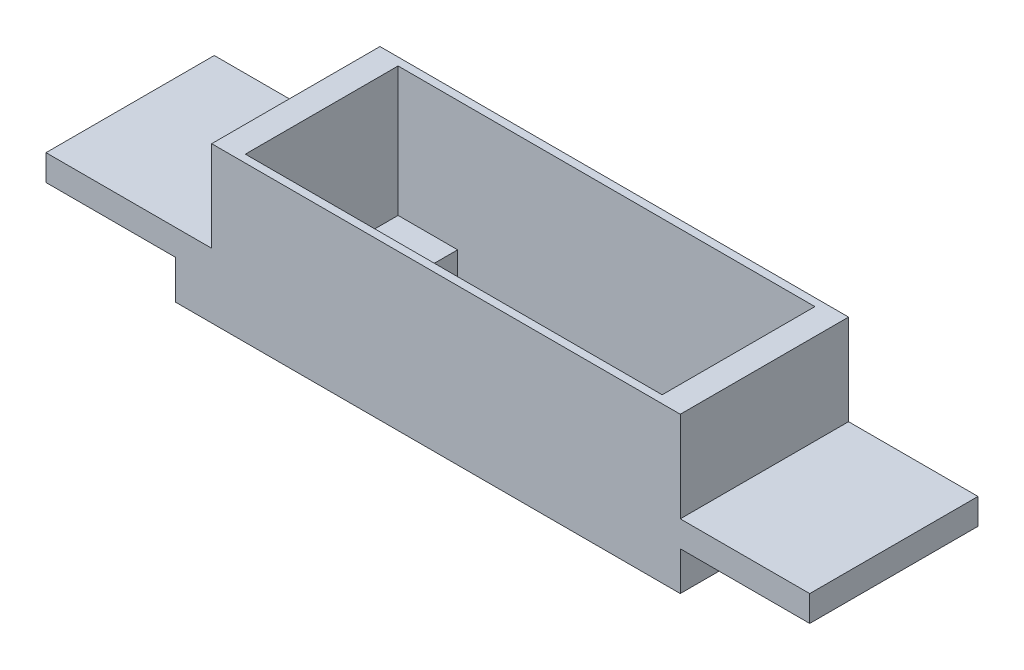
ISO-10303-21;
HEADER;
FILE_DESCRIPTION(('STEP AP214'),'2;1');
FILE_NAME('part.step','',(''),(''),'','','');
FILE_SCHEMA(('AUTOMOTIVE_DESIGN { 1 0 10303 214 1 1 1 1 }'));
ENDSEC;
DATA;
#1=APPLICATION_CONTEXT('core data for automotive mechanical design processes');
#2=APPLICATION_PROTOCOL_DEFINITION('international standard','automotive_design',2000,#1);
#3=PRODUCT_CONTEXT('',#1,'mechanical');
#4=PRODUCT('Part','Part','',(#3));
#5=PRODUCT_RELATED_PRODUCT_CATEGORY('part','',(#4));
#6=PRODUCT_DEFINITION_FORMATION('','',#4);
#7=PRODUCT_DEFINITION_CONTEXT('part definition',#1,'design');
#8=PRODUCT_DEFINITION('design','',#6,#7);
#9=PRODUCT_DEFINITION_SHAPE('','',#8);
#10=(LENGTH_UNIT() NAMED_UNIT(*) SI_UNIT(.MILLI.,.METRE.));
#11=(NAMED_UNIT(*) PLANE_ANGLE_UNIT() SI_UNIT($,.RADIAN.));
#12=(NAMED_UNIT(*) SI_UNIT($,.STERADIAN.) SOLID_ANGLE_UNIT());
#13=UNCERTAINTY_MEASURE_WITH_UNIT(LENGTH_MEASURE(1.E-05),#10,'distance_accuracy_value','');
#14=(GEOMETRIC_REPRESENTATION_CONTEXT(3) GLOBAL_UNCERTAINTY_ASSIGNED_CONTEXT((#13)) GLOBAL_UNIT_ASSIGNED_CONTEXT((#10,
#11,#12)) REPRESENTATION_CONTEXT('',''));
#15=CARTESIAN_POINT('',(0.,0.,0.));
#16=DIRECTION('',(0.,0.,1.));
#17=DIRECTION('',(1.,0.,0.));
#18=AXIS2_PLACEMENT_3D('',#15,#16,#17);
#19=CARTESIAN_POINT('',(0.,5.,0.));
#20=DIRECTION('',(0.,1.,0.));
#21=DIRECTION('',(0.,0.,1.));
#22=AXIS2_PLACEMENT_3D('',#19,#20,#21);
#23=PLANE('',#22);
#24=DIRECTION('',(-1.,0.,0.));
#25=VECTOR('',#24,1.);
#26=CARTESIAN_POINT('',(17.5,5.,-6.5));
#27=LINE('',#26,#25);
#28=CARTESIAN_POINT('',(29.5,5.,-6.5));
#29=VERTEX_POINT('',#28);
#30=CARTESIAN_POINT('',(19.5,5.,-6.5));
#31=VERTEX_POINT('',#30);
#32=EDGE_CURVE('E323',#29,#31,#27,.T.);
#33=ORIENTED_EDGE('',*,*,#32,.T.);
#34=DIRECTION('',(0.,0.,-1.));
#35=VECTOR('',#34,1.);
#36=CARTESIAN_POINT('',(19.5,5.,-6.5));
#37=LINE('',#36,#35);
#38=CARTESIAN_POINT('',(19.5,5.,6.5));
#39=VERTEX_POINT('',#38);
#40=EDGE_CURVE('E228',#39,#31,#37,.T.);
#41=ORIENTED_EDGE('',*,*,#40,.F.);
#42=DIRECTION('',(1.,0.,0.));
#43=VECTOR('',#42,1.);
#44=CARTESIAN_POINT('',(17.5,5.,6.5));
#45=LINE('',#44,#43);
#46=CARTESIAN_POINT('',(29.5,5.,6.5));
#47=VERTEX_POINT('',#46);
#48=EDGE_CURVE('E200',#39,#47,#45,.T.);
#49=ORIENTED_EDGE('',*,*,#48,.T.);
#50=DIRECTION('',(0.,0.,-1.));
#51=VECTOR('',#50,1.);
#52=CARTESIAN_POINT('',(29.5,5.,-6.5));
#53=LINE('',#52,#51);
#54=EDGE_CURVE('E338',#47,#29,#53,.T.);
#55=ORIENTED_EDGE('',*,*,#54,.T.);
#56=EDGE_LOOP('',(#33,#41,#49,#55));
#57=FACE_BOUND('',#56,.T.);
#58=ADVANCED_FACE('F43',(#57),#23,.T.);
#59=CARTESIAN_POINT('',(0.,5.,0.));
#60=DIRECTION('',(0.,-1.,0.));
#61=DIRECTION('',(0.,0.,-1.));
#62=AXIS2_PLACEMENT_3D('',#59,#60,#61);
#63=PLANE('',#62);
#64=DIRECTION('',(0.,0.,1.));
#65=VECTOR('',#64,1.);
#66=CARTESIAN_POINT('',(-16.7,5.,-6.5));
#67=LINE('',#66,#65);
#68=CARTESIAN_POINT('',(-16.7,5.,-6.5));
#69=VERTEX_POINT('',#68);
#70=CARTESIAN_POINT('',(-16.7,5.,6.5));
#71=VERTEX_POINT('',#70);
#72=EDGE_CURVE('E223',#69,#71,#67,.T.);
#73=ORIENTED_EDGE('',*,*,#72,.F.);
#74=DIRECTION('',(-1.,0.,0.));
#75=VECTOR('',#74,1.);
#76=CARTESIAN_POINT('',(-14.7,5.,-6.49999999999999));
#77=LINE('',#76,#75);
#78=CARTESIAN_POINT('',(-29.5,5.,-6.49999999999999));
#79=VERTEX_POINT('',#78);
#80=EDGE_CURVE('E343',#69,#79,#77,.T.);
#81=ORIENTED_EDGE('',*,*,#80,.T.);
#82=DIRECTION('',(0.,0.,1.));
#83=VECTOR('',#82,1.);
#84=CARTESIAN_POINT('',(-29.5,5.,-6.49999999999999));
#85=LINE('',#84,#83);
#86=CARTESIAN_POINT('',(-29.5,5.,6.5));
#87=VERTEX_POINT('',#86);
#88=EDGE_CURVE('E346',#79,#87,#85,.T.);
#89=ORIENTED_EDGE('',*,*,#88,.T.);
#90=DIRECTION('',(1.,0.,0.));
#91=VECTOR('',#90,1.);
#92=CARTESIAN_POINT('',(-14.7,5.,6.5));
#93=LINE('',#92,#91);
#94=EDGE_CURVE('E350',#87,#71,#93,.T.);
#95=ORIENTED_EDGE('',*,*,#94,.T.);
#96=EDGE_LOOP('',(#73,#81,#89,#95));
#97=FACE_BOUND('',#96,.T.);
#98=ADVANCED_FACE('F478',(#97),#63,.F.);
#99=CARTESIAN_POINT('',(0.,2.,0.));
#100=DIRECTION('',(0.,1.,0.));
#101=DIRECTION('',(0.,0.,1.));
#102=AXIS2_PLACEMENT_3D('',#99,#100,#101);
#103=PLANE('',#102);
#104=CARTESIAN_POINT('',(15.2,2.,0.));
#105=DIRECTION('',(0.,1.,0.));
#106=DIRECTION('',(0.,0.,1.));
#107=AXIS2_PLACEMENT_3D('',#104,#105,#106);
#108=CIRCLE('',#107,1.);
#109=CARTESIAN_POINT('',(15.2,2.,1.));
#110=VERTEX_POINT('',#109);
#111=EDGE_CURVE('E263',#110,#110,#108,.T.);
#112=ORIENTED_EDGE('',*,*,#111,.F.);
#113=EDGE_LOOP('',(#112));
#114=FACE_BOUND('',#113,.T.);
#115=DIRECTION('',(0.,0.,1.));
#116=VECTOR('',#115,1.);
#117=CARTESIAN_POINT('',(17.5,2.,-6.5));
#118=LINE('',#117,#116);
#119=CARTESIAN_POINT('',(17.5,2.,-5.9));
#120=VERTEX_POINT('',#119);
#121=CARTESIAN_POINT('',(17.5,2.,5.9));
#122=VERTEX_POINT('',#121);
#123=EDGE_CURVE('E375',#120,#122,#118,.T.);
#124=ORIENTED_EDGE('',*,*,#123,.F.);
#125=DIRECTION('',(1.,0.,0.));
#126=VECTOR('',#125,1.);
#127=CARTESIAN_POINT('',(-14.7,2.,-5.9));
#128=LINE('',#127,#126);
#129=CARTESIAN_POINT('',(12.9,2.,-5.9));
#130=VERTEX_POINT('',#129);
#131=EDGE_CURVE('E244',#130,#120,#128,.T.);
#132=ORIENTED_EDGE('',*,*,#131,.F.);
#133=DIRECTION('',(0.,0.,-1.));
#134=VECTOR('',#133,1.);
#135=CARTESIAN_POINT('',(12.9,2.,-5.9));
#136=LINE('',#135,#134);
#137=CARTESIAN_POINT('',(12.9,2.,5.9));
#138=VERTEX_POINT('',#137);
#139=EDGE_CURVE('E275',#138,#130,#136,.T.);
#140=ORIENTED_EDGE('',*,*,#139,.F.);
#141=DIRECTION('',(-1.,0.,0.));
#142=VECTOR('',#141,1.);
#143=CARTESIAN_POINT('',(-14.7,2.,5.9));
#144=LINE('',#143,#142);
#145=EDGE_CURVE('E194',#122,#138,#144,.T.);
#146=ORIENTED_EDGE('',*,*,#145,.F.);
#147=EDGE_LOOP('',(#124,#132,#140,#146));
#148=FACE_BOUND('',#147,.T.);
#149=ADVANCED_FACE('F457',(#114,#148),#103,.T.);
#150=CARTESIAN_POINT('',(-12.4,2.,0.));
#151=DIRECTION('',(0.,1.,0.));
#152=DIRECTION('',(0.,0.,1.));
#153=AXIS2_PLACEMENT_3D('',#150,#151,#152);
#154=CIRCLE('',#153,1.);
#155=CARTESIAN_POINT('',(-12.4,2.,1.));
#156=VERTEX_POINT('',#155);
#157=EDGE_CURVE('E267',#156,#156,#154,.T.);
#158=ORIENTED_EDGE('',*,*,#157,.F.);
#159=EDGE_LOOP('',(#158));
#160=FACE_BOUND('',#159,.T.);
#161=DIRECTION('',(0.,0.,1.));
#162=VECTOR('',#161,1.);
#163=CARTESIAN_POINT('',(-10.1,2.,-5.9));
#164=LINE('',#163,#162);
#165=CARTESIAN_POINT('',(-10.1,2.,-5.9));
#166=VERTEX_POINT('',#165);
#167=CARTESIAN_POINT('',(-10.1,2.,5.9));
#168=VERTEX_POINT('',#167);
#169=EDGE_CURVE('E284',#166,#168,#164,.T.);
#170=ORIENTED_EDGE('',*,*,#169,.F.);
#171=CARTESIAN_POINT('',(-14.7,2.,-5.9));
#172=VERTEX_POINT('',#171);
#173=EDGE_CURVE('E240',#172,#166,#128,.T.);
#174=ORIENTED_EDGE('',*,*,#173,.F.);
#175=DIRECTION('',(0.,0.,-1.));
#176=VECTOR('',#175,1.);
#177=CARTESIAN_POINT('',(-14.7,2.,-6.49999999999999));
#178=LINE('',#177,#176);
#179=CARTESIAN_POINT('',(-14.7,2.,5.9));
#180=VERTEX_POINT('',#179);
#181=EDGE_CURVE('E371',#180,#172,#178,.T.);
#182=ORIENTED_EDGE('',*,*,#181,.F.);
#183=EDGE_CURVE('E243',#168,#180,#144,.T.);
#184=ORIENTED_EDGE('',*,*,#183,.F.);
#185=EDGE_LOOP('',(#170,#174,#182,#184));
#186=FACE_BOUND('',#185,.T.);
#187=ADVANCED_FACE('F444',(#160,#186),#103,.T.);
#188=CARTESIAN_POINT('',(17.5,3.,-6.5));
#189=DIRECTION('',(1.,0.,0.));
#190=DIRECTION('',(0.,0.,-1.));
#191=AXIS2_PLACEMENT_3D('',#188,#189,#190);
#192=PLANE('',#191);
#193=DIRECTION('',(0.,-1.,0.));
#194=VECTOR('',#193,1.);
#195=CARTESIAN_POINT('',(17.5,12.,-5.9));
#196=LINE('',#195,#194);
#197=CARTESIAN_POINT('',(17.5,12.,-5.9));
#198=VERTEX_POINT('',#197);
#199=EDGE_CURVE('E235',#198,#120,#196,.T.);
#200=ORIENTED_EDGE('',*,*,#199,.T.);
#201=ORIENTED_EDGE('',*,*,#123,.T.);
#202=DIRECTION('',(0.,-1.,0.));
#203=VECTOR('',#202,1.);
#204=CARTESIAN_POINT('',(17.5,12.,5.9));
#205=LINE('',#204,#203);
#206=CARTESIAN_POINT('',(17.5,12.,5.9));
#207=VERTEX_POINT('',#206);
#208=EDGE_CURVE('E259',#207,#122,#205,.T.);
#209=ORIENTED_EDGE('',*,*,#208,.F.);
#210=DIRECTION('',(0.,0.,-1.));
#211=VECTOR('',#210,1.);
#212=CARTESIAN_POINT('',(17.5,12.,-6.5));
#213=LINE('',#212,#211);
#214=EDGE_CURVE('E209',#207,#198,#213,.T.);
#215=ORIENTED_EDGE('',*,*,#214,.T.);
#216=EDGE_LOOP('',(#200,#201,#209,#215));
#217=FACE_BOUND('',#216,.T.);
#218=ADVANCED_FACE('F454',(#217),#192,.F.);
#219=CARTESIAN_POINT('',(-14.7,3.,-6.49999999999999));
#220=DIRECTION('',(-1.,0.,0.));
#221=DIRECTION('',(0.,0.,1.));
#222=AXIS2_PLACEMENT_3D('',#219,#220,#221);
#223=PLANE('',#222);
#224=ORIENTED_EDGE('',*,*,#181,.T.);
#225=DIRECTION('',(0.,-1.,0.));
#226=VECTOR('',#225,1.);
#227=CARTESIAN_POINT('',(-14.7,12.,-5.9));
#228=LINE('',#227,#226);
#229=CARTESIAN_POINT('',(-14.7,12.,-5.9));
#230=VERTEX_POINT('',#229);
#231=EDGE_CURVE('E222',#230,#172,#228,.T.);
#232=ORIENTED_EDGE('',*,*,#231,.F.);
#233=DIRECTION('',(0.,0.,1.));
#234=VECTOR('',#233,1.);
#235=CARTESIAN_POINT('',(-14.7,12.,-6.5));
#236=LINE('',#235,#234);
#237=CARTESIAN_POINT('',(-14.7,12.,5.9));
#238=VERTEX_POINT('',#237);
#239=EDGE_CURVE('E218',#230,#238,#236,.T.);
#240=ORIENTED_EDGE('',*,*,#239,.T.);
#241=DIRECTION('',(0.,-1.,0.));
#242=VECTOR('',#241,1.);
#243=CARTESIAN_POINT('',(-14.7,12.,5.9));
#244=LINE('',#243,#242);
#245=EDGE_CURVE('E254',#238,#180,#244,.T.);
#246=ORIENTED_EDGE('',*,*,#245,.T.);
#247=EDGE_LOOP('',(#224,#232,#240,#246));
#248=FACE_BOUND('',#247,.T.);
#249=ADVANCED_FACE('F447',(#248),#223,.F.);
#250=CARTESIAN_POINT('',(19.5,2.,-6.5));
#251=DIRECTION('',(-1.,0.,0.));
#252=DIRECTION('',(0.,0.,1.));
#253=AXIS2_PLACEMENT_3D('',#250,#251,#252);
#254=PLANE('',#253);
#255=DIRECTION('',(0.,0.,-1.));
#256=VECTOR('',#255,1.);
#257=CARTESIAN_POINT('',(19.5,0.,-6.5));
#258=LINE('',#257,#256);
#259=CARTESIAN_POINT('',(19.5,0.,6.5));
#260=VERTEX_POINT('',#259);
#261=CARTESIAN_POINT('',(19.5,0.,-6.5));
#262=VERTEX_POINT('',#261);
#263=EDGE_CURVE('E383',#260,#262,#258,.T.);
#264=ORIENTED_EDGE('',*,*,#263,.T.);
#265=DIRECTION('',(0.,-1.,0.));
#266=VECTOR('',#265,1.);
#267=CARTESIAN_POINT('',(19.5,2.,-6.5));
#268=LINE('',#267,#266);
#269=CARTESIAN_POINT('',(19.5,3.,-6.5));
#270=VERTEX_POINT('',#269);
#271=EDGE_CURVE('E11',#270,#262,#268,.T.);
#272=ORIENTED_EDGE('',*,*,#271,.F.);
#273=DIRECTION('',(0.,0.,-1.));
#274=VECTOR('',#273,1.);
#275=CARTESIAN_POINT('',(19.5,3.,-6.5));
#276=LINE('',#275,#274);
#277=CARTESIAN_POINT('',(19.5,3.,6.5));
#278=VERTEX_POINT('',#277);
#279=EDGE_CURVE('E379',#278,#270,#276,.T.);
#280=ORIENTED_EDGE('',*,*,#279,.F.);
#281=DIRECTION('',(0.,-1.,0.));
#282=VECTOR('',#281,1.);
#283=CARTESIAN_POINT('',(19.5,2.,6.5));
#284=LINE('',#283,#282);
#285=EDGE_CURVE('E398',#278,#260,#284,.T.);
#286=ORIENTED_EDGE('',*,*,#285,.T.);
#287=EDGE_LOOP('',(#264,#272,#280,#286));
#288=FACE_BOUND('',#287,.T.);
#289=ADVANCED_FACE('F45',(#288),#254,.F.);
#290=CARTESIAN_POINT('',(-19.5,2.,-6.5));
#291=DIRECTION('',(0.,0.,1.));
#292=DIRECTION('',(1.,0.,0.));
#293=AXIS2_PLACEMENT_3D('',#290,#291,#292);
#294=PLANE('',#293);
#295=ORIENTED_EDGE('',*,*,#80,.F.);
#296=DIRECTION('',(0.,-1.,0.));
#297=VECTOR('',#296,1.);
#298=CARTESIAN_POINT('',(-16.7,25.1529464379659,-6.5));
#299=LINE('',#298,#297);
#300=CARTESIAN_POINT('',(-16.7,12.,-6.5));
#301=VERTEX_POINT('',#300);
#302=EDGE_CURVE('E219',#301,#69,#299,.T.);
#303=ORIENTED_EDGE('',*,*,#302,.F.);
#304=DIRECTION('',(-1.,0.,0.));
#305=VECTOR('',#304,1.);
#306=CARTESIAN_POINT('',(-14.7,12.,-6.5));
#307=LINE('',#306,#305);
#308=CARTESIAN_POINT('',(19.5,12.,-6.5));
#309=VERTEX_POINT('',#308);
#310=EDGE_CURVE('E239',#309,#301,#307,.T.);
#311=ORIENTED_EDGE('',*,*,#310,.F.);
#312=DIRECTION('',(0.,-1.,0.));
#313=VECTOR('',#312,1.);
#314=CARTESIAN_POINT('',(19.5,25.1529464379659,-6.5));
#315=LINE('',#314,#313);
#316=EDGE_CURVE('E205',#309,#31,#315,.T.);
#317=ORIENTED_EDGE('',*,*,#316,.T.);
#318=ORIENTED_EDGE('',*,*,#32,.F.);
#319=DIRECTION('',(0.,-1.,0.));
#320=VECTOR('',#319,1.);
#321=CARTESIAN_POINT('',(29.5,5.,-6.5));
#322=LINE('',#321,#320);
#323=CARTESIAN_POINT('',(29.5,3.,-6.5));
#324=VERTEX_POINT('',#323);
#325=EDGE_CURVE('E319',#29,#324,#322,.T.);
#326=ORIENTED_EDGE('',*,*,#325,.T.);
#327=DIRECTION('',(-1.,0.,0.));
#328=VECTOR('',#327,1.);
#329=CARTESIAN_POINT('',(17.5,3.,-6.5));
#330=LINE('',#329,#328);
#331=EDGE_CURVE('E324',#324,#270,#330,.T.);
#332=ORIENTED_EDGE('',*,*,#331,.T.);
#333=ORIENTED_EDGE('',*,*,#271,.T.);
#334=DIRECTION('',(-1.,0.,0.));
#335=VECTOR('',#334,1.);
#336=CARTESIAN_POINT('',(-19.5,0.,-6.5));
#337=LINE('',#336,#335);
#338=CARTESIAN_POINT('',(-19.5,0.,-6.5));
#339=VERTEX_POINT('',#338);
#340=EDGE_CURVE('E390',#262,#339,#337,.T.);
#341=ORIENTED_EDGE('',*,*,#340,.T.);
#342=DIRECTION('',(0.,-1.,0.));
#343=VECTOR('',#342,1.);
#344=CARTESIAN_POINT('',(-19.5,2.,-6.5));
#345=LINE('',#344,#343);
#346=CARTESIAN_POINT('',(-19.5,3.,-6.5));
#347=VERTEX_POINT('',#346);
#348=EDGE_CURVE('E52',#347,#339,#345,.T.);
#349=ORIENTED_EDGE('',*,*,#348,.F.);
#350=DIRECTION('',(-1.,0.,0.));
#351=VECTOR('',#350,1.);
#352=CARTESIAN_POINT('',(-14.7,3.,-6.49999999999999));
#353=LINE('',#352,#351);
#354=CARTESIAN_POINT('',(-29.5,3.,-6.49999999999999));
#355=VERTEX_POINT('',#354);
#356=EDGE_CURVE('E334',#347,#355,#353,.T.);
#357=ORIENTED_EDGE('',*,*,#356,.T.);
#358=DIRECTION('',(0.,-1.,0.));
#359=VECTOR('',#358,1.);
#360=CARTESIAN_POINT('',(-29.5,5.,-6.49999999999999));
#361=LINE('',#360,#359);
#362=EDGE_CURVE('E366',#79,#355,#361,.T.);
#363=ORIENTED_EDGE('',*,*,#362,.F.);
#364=EDGE_LOOP('',(#295,#303,#311,#317,#318,#326,#332,#333,#341,#349,#357,#363));
#365=FACE_BOUND('',#364,.T.);
#366=ADVANCED_FACE('F426',(#365),#294,.F.);
#367=CARTESIAN_POINT('',(-19.5,2.,-6.5));
#368=DIRECTION('',(1.,0.,0.));
#369=DIRECTION('',(0.,0.,-1.));
#370=AXIS2_PLACEMENT_3D('',#367,#368,#369);
#371=PLANE('',#370);
#372=DIRECTION('',(0.,0.,1.));
#373=VECTOR('',#372,1.);
#374=CARTESIAN_POINT('',(-19.5,0.,-6.5));
#375=LINE('',#374,#373);
#376=CARTESIAN_POINT('',(-19.5,0.,6.5));
#377=VERTEX_POINT('',#376);
#378=EDGE_CURVE('E393',#339,#377,#375,.T.);
#379=ORIENTED_EDGE('',*,*,#378,.T.);
#380=DIRECTION('',(0.,-1.,0.));
#381=VECTOR('',#380,1.);
#382=CARTESIAN_POINT('',(-19.5,2.,6.5));
#383=LINE('',#382,#381);
#384=CARTESIAN_POINT('',(-19.5,3.,6.5));
#385=VERTEX_POINT('',#384);
#386=EDGE_CURVE('E401',#385,#377,#383,.T.);
#387=ORIENTED_EDGE('',*,*,#386,.F.);
#388=DIRECTION('',(0.,0.,1.));
#389=VECTOR('',#388,1.);
#390=CARTESIAN_POINT('',(-19.5,3.,-6.5));
#391=LINE('',#390,#389);
#392=EDGE_CURVE('E370',#347,#385,#391,.T.);
#393=ORIENTED_EDGE('',*,*,#392,.F.);
#394=ORIENTED_EDGE('',*,*,#348,.T.);
#395=EDGE_LOOP('',(#379,#387,#393,#394));
#396=FACE_BOUND('',#395,.T.);
#397=ADVANCED_FACE('F408',(#396),#371,.F.);
#398=CARTESIAN_POINT('',(-19.5,2.,6.5));
#399=DIRECTION('',(0.,0.,-1.));
#400=DIRECTION('',(-1.,0.,0.));
#401=AXIS2_PLACEMENT_3D('',#398,#399,#400);
#402=PLANE('',#401);
#403=ORIENTED_EDGE('',*,*,#48,.F.);
#404=DIRECTION('',(0.,-1.,0.));
#405=VECTOR('',#404,1.);
#406=CARTESIAN_POINT('',(19.5,25.1529464379659,6.5));
#407=LINE('',#406,#405);
#408=CARTESIAN_POINT('',(19.5,12.,6.5));
#409=VERTEX_POINT('',#408);
#410=EDGE_CURVE('E197',#409,#39,#407,.T.);
#411=ORIENTED_EDGE('',*,*,#410,.F.);
#412=DIRECTION('',(1.,0.,0.));
#413=VECTOR('',#412,1.);
#414=CARTESIAN_POINT('',(-14.7,12.,6.5));
#415=LINE('',#414,#413);
#416=CARTESIAN_POINT('',(-16.7,12.,6.5));
#417=VERTEX_POINT('',#416);
#418=EDGE_CURVE('E183',#417,#409,#415,.T.);
#419=ORIENTED_EDGE('',*,*,#418,.F.);
#420=DIRECTION('',(0.,-1.,0.));
#421=VECTOR('',#420,1.);
#422=CARTESIAN_POINT('',(-16.7,25.1529464379659,6.5));
#423=LINE('',#422,#421);
#424=EDGE_CURVE('E227',#417,#71,#423,.T.);
#425=ORIENTED_EDGE('',*,*,#424,.T.);
#426=ORIENTED_EDGE('',*,*,#94,.F.);
#427=DIRECTION('',(0.,-1.,0.));
#428=VECTOR('',#427,1.);
#429=CARTESIAN_POINT('',(-29.5,5.,6.5));
#430=LINE('',#429,#428);
#431=CARTESIAN_POINT('',(-29.5,3.,6.5));
#432=VERTEX_POINT('',#431);
#433=EDGE_CURVE('E354',#87,#432,#430,.T.);
#434=ORIENTED_EDGE('',*,*,#433,.T.);
#435=DIRECTION('',(1.,0.,0.));
#436=VECTOR('',#435,1.);
#437=CARTESIAN_POINT('',(-14.7,3.,6.5));
#438=LINE('',#437,#436);
#439=EDGE_CURVE('E347',#432,#385,#438,.T.);
#440=ORIENTED_EDGE('',*,*,#439,.T.);
#441=ORIENTED_EDGE('',*,*,#386,.T.);
#442=DIRECTION('',(1.,0.,0.));
#443=VECTOR('',#442,1.);
#444=CARTESIAN_POINT('',(-19.5,0.,6.5));
#445=LINE('',#444,#443);
#446=EDGE_CURVE('E67',#377,#260,#445,.T.);
#447=ORIENTED_EDGE('',*,*,#446,.T.);
#448=ORIENTED_EDGE('',*,*,#285,.F.);
#449=DIRECTION('',(1.,0.,0.));
#450=VECTOR('',#449,1.);
#451=CARTESIAN_POINT('',(17.5,3.,6.5));
#452=LINE('',#451,#450);
#453=CARTESIAN_POINT('',(29.5,3.,6.5));
#454=VERTEX_POINT('',#453);
#455=EDGE_CURVE('E331',#278,#454,#452,.T.);
#456=ORIENTED_EDGE('',*,*,#455,.T.);
#457=DIRECTION('',(0.,-1.,0.));
#458=VECTOR('',#457,1.);
#459=CARTESIAN_POINT('',(29.5,5.,6.5));
#460=LINE('',#459,#458);
#461=EDGE_CURVE('E305',#47,#454,#460,.T.);
#462=ORIENTED_EDGE('',*,*,#461,.F.);
#463=EDGE_LOOP('',(#403,#411,#419,#425,#426,#434,#440,#441,#447,#448,#456,#462));
#464=FACE_BOUND('',#463,.T.);
#465=ADVANCED_FACE('F198',(#464),#402,.F.);
#466=CARTESIAN_POINT('',(0.,0.,0.));
#467=DIRECTION('',(0.,1.,0.));
#468=DIRECTION('',(0.,0.,1.));
#469=AXIS2_PLACEMENT_3D('',#466,#467,#468);
#470=PLANE('',#469);
#471=DIRECTION('',(1.,0.,0.));
#472=VECTOR('',#471,1.);
#473=CARTESIAN_POINT('',(-10.1,0.,5.9));
#474=LINE('',#473,#472);
#475=CARTESIAN_POINT('',(-10.1,0.,5.9));
#476=VERTEX_POINT('',#475);
#477=CARTESIAN_POINT('',(12.9,0.,5.9));
#478=VERTEX_POINT('',#477);
#479=EDGE_CURVE('E290',#476,#478,#474,.T.);
#480=ORIENTED_EDGE('',*,*,#479,.T.);
#481=DIRECTION('',(0.,0.,-1.));
#482=VECTOR('',#481,1.);
#483=CARTESIAN_POINT('',(12.9,0.,-5.9));
#484=LINE('',#483,#482);
#485=CARTESIAN_POINT('',(12.9,0.,-5.9));
#486=VERTEX_POINT('',#485);
#487=EDGE_CURVE('E279',#478,#486,#484,.T.);
#488=ORIENTED_EDGE('',*,*,#487,.T.);
#489=DIRECTION('',(-1.,0.,0.));
#490=VECTOR('',#489,1.);
#491=CARTESIAN_POINT('',(-10.1,0.,-5.9));
#492=LINE('',#491,#490);
#493=CARTESIAN_POINT('',(-10.1,0.,-5.9));
#494=VERTEX_POINT('',#493);
#495=EDGE_CURVE('E283',#486,#494,#492,.T.);
#496=ORIENTED_EDGE('',*,*,#495,.T.);
#497=DIRECTION('',(0.,0.,1.));
#498=VECTOR('',#497,1.);
#499=CARTESIAN_POINT('',(-10.1,0.,-5.9));
#500=LINE('',#499,#498);
#501=EDGE_CURVE('E59',#494,#476,#500,.T.);
#502=ORIENTED_EDGE('',*,*,#501,.T.);
#503=EDGE_LOOP('',(#480,#488,#496,#502));
#504=FACE_BOUND('',#503,.T.);
#505=ORIENTED_EDGE('',*,*,#263,.F.);
#506=ORIENTED_EDGE('',*,*,#446,.F.);
#507=ORIENTED_EDGE('',*,*,#378,.F.);
#508=ORIENTED_EDGE('',*,*,#340,.F.);
#509=EDGE_LOOP('',(#505,#506,#507,#508));
#510=FACE_BOUND('',#509,.T.);
#511=ADVANCED_FACE('F413',(#504,#510),#470,.F.);
#512=CARTESIAN_POINT('',(0.,3.,0.));
#513=DIRECTION('',(0.,-1.,0.));
#514=DIRECTION('',(0.,0.,-1.));
#515=AXIS2_PLACEMENT_3D('',#512,#513,#514);
#516=PLANE('',#515);
#517=ORIENTED_EDGE('',*,*,#392,.T.);
#518=ORIENTED_EDGE('',*,*,#439,.F.);
#519=DIRECTION('',(0.,0.,1.));
#520=VECTOR('',#519,1.);
#521=CARTESIAN_POINT('',(-29.5,3.,-6.49999999999999));
#522=LINE('',#521,#520);
#523=EDGE_CURVE('E357',#355,#432,#522,.T.);
#524=ORIENTED_EDGE('',*,*,#523,.F.);
#525=ORIENTED_EDGE('',*,*,#356,.F.);
#526=EDGE_LOOP('',(#517,#518,#524,#525));
#527=FACE_BOUND('',#526,.T.);
#528=ADVANCED_FACE('F466',(#527),#516,.T.);
#529=CARTESIAN_POINT('',(-29.5,5.,-6.49999999999999));
#530=DIRECTION('',(1.,0.,0.));
#531=DIRECTION('',(0.,0.,-1.));
#532=AXIS2_PLACEMENT_3D('',#529,#530,#531);
#533=PLANE('',#532);
#534=ORIENTED_EDGE('',*,*,#523,.T.);
#535=ORIENTED_EDGE('',*,*,#433,.F.);
#536=ORIENTED_EDGE('',*,*,#88,.F.);
#537=ORIENTED_EDGE('',*,*,#362,.T.);
#538=EDGE_LOOP('',(#534,#535,#536,#537));
#539=FACE_BOUND('',#538,.T.);
#540=ADVANCED_FACE('F472',(#539),#533,.F.);
#541=CARTESIAN_POINT('',(0.,3.,0.));
#542=DIRECTION('',(0.,1.,0.));
#543=DIRECTION('',(0.,0.,1.));
#544=AXIS2_PLACEMENT_3D('',#541,#542,#543);
#545=PLANE('',#544);
#546=ORIENTED_EDGE('',*,*,#455,.F.);
#547=ORIENTED_EDGE('',*,*,#279,.T.);
#548=ORIENTED_EDGE('',*,*,#331,.F.);
#549=DIRECTION('',(0.,0.,-1.));
#550=VECTOR('',#549,1.);
#551=CARTESIAN_POINT('',(29.5,3.,-6.5));
#552=LINE('',#551,#550);
#553=EDGE_CURVE('E328',#454,#324,#552,.T.);
#554=ORIENTED_EDGE('',*,*,#553,.F.);
#555=EDGE_LOOP('',(#546,#547,#548,#554));
#556=FACE_BOUND('',#555,.T.);
#557=ADVANCED_FACE('F424',(#556),#545,.F.);
#558=CARTESIAN_POINT('',(29.5,5.,-6.5));
#559=DIRECTION('',(-1.,0.,0.));
#560=DIRECTION('',(0.,0.,1.));
#561=AXIS2_PLACEMENT_3D('',#558,#559,#560);
#562=PLANE('',#561);
#563=ORIENTED_EDGE('',*,*,#553,.T.);
#564=ORIENTED_EDGE('',*,*,#325,.F.);
#565=ORIENTED_EDGE('',*,*,#54,.F.);
#566=ORIENTED_EDGE('',*,*,#461,.T.);
#567=EDGE_LOOP('',(#563,#564,#565,#566));
#568=FACE_BOUND('',#567,.T.);
#569=ADVANCED_FACE('F421',(#568),#562,.F.);
#570=CARTESIAN_POINT('',(12.9,0.,-5.9));
#571=DIRECTION('',(1.,0.,0.));
#572=DIRECTION('',(0.,0.,-1.));
#573=AXIS2_PLACEMENT_3D('',#570,#571,#572);
#574=PLANE('',#573);
#575=ORIENTED_EDGE('',*,*,#139,.T.);
#576=DIRECTION('',(0.,1.,0.));
#577=VECTOR('',#576,1.);
#578=CARTESIAN_POINT('',(12.9,0.,-5.9));
#579=LINE('',#578,#577);
#580=EDGE_CURVE('E294',#486,#130,#579,.T.);
#581=ORIENTED_EDGE('',*,*,#580,.F.);
#582=ORIENTED_EDGE('',*,*,#487,.F.);
#583=DIRECTION('',(0.,1.,0.));
#584=VECTOR('',#583,1.);
#585=CARTESIAN_POINT('',(12.9,0.,5.9));
#586=LINE('',#585,#584);
#587=EDGE_CURVE('E301',#478,#138,#586,.T.);
#588=ORIENTED_EDGE('',*,*,#587,.T.);
#589=EDGE_LOOP('',(#575,#581,#582,#588));
#590=FACE_BOUND('',#589,.T.);
#591=ADVANCED_FACE('F459',(#590),#574,.F.);
#592=CARTESIAN_POINT('',(-10.1,0.,5.9));
#593=DIRECTION('',(0.,0.,1.));
#594=DIRECTION('',(1.,0.,0.));
#595=AXIS2_PLACEMENT_3D('',#592,#593,#594);
#596=PLANE('',#595);
#597=DIRECTION('',(0.,1.,0.));
#598=VECTOR('',#597,1.);
#599=CARTESIAN_POINT('',(-10.1,0.,5.9));
#600=LINE('',#599,#598);
#601=EDGE_CURVE('E306',#476,#168,#600,.T.);
#602=ORIENTED_EDGE('',*,*,#601,.T.);
#603=ORIENTED_EDGE('',*,*,#183,.T.);
#604=ORIENTED_EDGE('',*,*,#245,.F.);
#605=DIRECTION('',(-1.,0.,0.));
#606=VECTOR('',#605,1.);
#607=CARTESIAN_POINT('',(-14.7,12.,5.9));
#608=LINE('',#607,#606);
#609=EDGE_CURVE('E193',#207,#238,#608,.T.);
#610=ORIENTED_EDGE('',*,*,#609,.F.);
#611=ORIENTED_EDGE('',*,*,#208,.T.);
#612=ORIENTED_EDGE('',*,*,#145,.T.);
#613=ORIENTED_EDGE('',*,*,#587,.F.);
#614=ORIENTED_EDGE('',*,*,#479,.F.);
#615=EDGE_LOOP('',(#602,#603,#604,#610,#611,#612,#613,#614));
#616=FACE_BOUND('',#615,.T.);
#617=ADVANCED_FACE('F438',(#616),#596,.F.);
#618=CARTESIAN_POINT('',(-10.1,0.,-5.9));
#619=DIRECTION('',(-1.,0.,0.));
#620=DIRECTION('',(0.,0.,1.));
#621=AXIS2_PLACEMENT_3D('',#618,#619,#620);
#622=PLANE('',#621);
#623=ORIENTED_EDGE('',*,*,#169,.T.);
#624=ORIENTED_EDGE('',*,*,#601,.F.);
#625=ORIENTED_EDGE('',*,*,#501,.F.);
#626=DIRECTION('',(0.,1.,0.));
#627=VECTOR('',#626,1.);
#628=CARTESIAN_POINT('',(-10.1,0.,-5.9));
#629=LINE('',#628,#627);
#630=EDGE_CURVE('E310',#494,#166,#629,.T.);
#631=ORIENTED_EDGE('',*,*,#630,.T.);
#632=EDGE_LOOP('',(#623,#624,#625,#631));
#633=FACE_BOUND('',#632,.T.);
#634=ADVANCED_FACE('F526',(#633),#622,.F.);
#635=CARTESIAN_POINT('',(-10.1,0.,-5.9));
#636=DIRECTION('',(0.,0.,-1.));
#637=DIRECTION('',(-1.,0.,0.));
#638=AXIS2_PLACEMENT_3D('',#635,#636,#637);
#639=PLANE('',#638);
#640=ORIENTED_EDGE('',*,*,#580,.T.);
#641=ORIENTED_EDGE('',*,*,#131,.T.);
#642=ORIENTED_EDGE('',*,*,#199,.F.);
#643=DIRECTION('',(1.,0.,0.));
#644=VECTOR('',#643,1.);
#645=CARTESIAN_POINT('',(-14.7,12.,-5.9));
#646=LINE('',#645,#644);
#647=EDGE_CURVE('E247',#230,#198,#646,.T.);
#648=ORIENTED_EDGE('',*,*,#647,.F.);
#649=ORIENTED_EDGE('',*,*,#231,.T.);
#650=ORIENTED_EDGE('',*,*,#173,.T.);
#651=ORIENTED_EDGE('',*,*,#630,.F.);
#652=ORIENTED_EDGE('',*,*,#495,.F.);
#653=EDGE_LOOP('',(#640,#641,#642,#648,#649,#650,#651,#652));
#654=FACE_BOUND('',#653,.T.);
#655=ADVANCED_FACE('F463',(#654),#639,.F.);
#656=CARTESIAN_POINT('',(-12.4,5.,0.));
#657=DIRECTION('',(0.,-1.,0.));
#658=DIRECTION('',(0.,0.,-1.));
#659=AXIS2_PLACEMENT_3D('',#656,#657,#658);
#660=CYLINDRICAL_SURFACE('',#659,1.);
#661=CARTESIAN_POINT('',(-12.4,5.,0.));
#662=DIRECTION('',(0.,1.,0.));
#663=DIRECTION('',(0.,0.,1.));
#664=AXIS2_PLACEMENT_3D('',#661,#662,#663);
#665=CIRCLE('',#664,1.);
#666=CARTESIAN_POINT('',(-12.4,5.,1.));
#667=VERTEX_POINT('',#666);
#668=EDGE_CURVE('E271',#667,#667,#665,.T.);
#669=ORIENTED_EDGE('',*,*,#668,.F.);
#670=EDGE_LOOP('',(#669));
#671=FACE_BOUND('',#670,.T.);
#672=ORIENTED_EDGE('',*,*,#157,.T.);
#673=EDGE_LOOP('',(#672));
#674=FACE_BOUND('',#673,.T.);
#675=ADVANCED_FACE('F514',(#671,#674),#660,.T.);
#676=CARTESIAN_POINT('',(-12.4,5.,0.));
#677=DIRECTION('',(0.,1.,0.));
#678=DIRECTION('',(0.,0.,1.));
#679=AXIS2_PLACEMENT_3D('',#676,#677,#678);
#680=PLANE('',#679);
#681=ORIENTED_EDGE('',*,*,#668,.T.);
#682=EDGE_LOOP('',(#681));
#683=FACE_BOUND('',#682,.T.);
#684=ADVANCED_FACE('F505',(#683),#680,.T.);
#685=CARTESIAN_POINT('',(15.2,5.,0.));
#686=DIRECTION('',(0.,-1.,0.));
#687=DIRECTION('',(0.,0.,-1.));
#688=AXIS2_PLACEMENT_3D('',#685,#686,#687);
#689=CYLINDRICAL_SURFACE('',#688,1.);
#690=CARTESIAN_POINT('',(15.2,5.,0.));
#691=DIRECTION('',(0.,1.,0.));
#692=DIRECTION('',(0.,0.,1.));
#693=AXIS2_PLACEMENT_3D('',#690,#691,#692);
#694=CIRCLE('',#693,1.);
#695=CARTESIAN_POINT('',(15.2,5.,1.));
#696=VERTEX_POINT('',#695);
#697=EDGE_CURVE('E262',#696,#696,#694,.T.);
#698=ORIENTED_EDGE('',*,*,#697,.F.);
#699=EDGE_LOOP('',(#698));
#700=FACE_BOUND('',#699,.T.);
#701=ORIENTED_EDGE('',*,*,#111,.T.);
#702=EDGE_LOOP('',(#701));
#703=FACE_BOUND('',#702,.T.);
#704=ADVANCED_FACE('F502',(#700,#703),#689,.T.);
#705=CARTESIAN_POINT('',(15.2,5.,0.));
#706=DIRECTION('',(0.,1.,0.));
#707=DIRECTION('',(0.,0.,1.));
#708=AXIS2_PLACEMENT_3D('',#705,#706,#707);
#709=PLANE('',#708);
#710=ORIENTED_EDGE('',*,*,#697,.T.);
#711=EDGE_LOOP('',(#710));
#712=FACE_BOUND('',#711,.T.);
#713=ADVANCED_FACE('F504',(#712),#709,.T.);
#714=CARTESIAN_POINT('',(0.,12.,0.));
#715=DIRECTION('',(0.,-1.,0.));
#716=DIRECTION('',(0.,0.,-1.));
#717=AXIS2_PLACEMENT_3D('',#714,#715,#716);
#718=PLANE('',#717);
#719=ORIENTED_EDGE('',*,*,#214,.F.);
#720=ORIENTED_EDGE('',*,*,#609,.T.);
#721=ORIENTED_EDGE('',*,*,#239,.F.);
#722=ORIENTED_EDGE('',*,*,#647,.T.);
#723=EDGE_LOOP('',(#719,#720,#721,#722));
#724=FACE_BOUND('',#723,.T.);
#725=ORIENTED_EDGE('',*,*,#418,.T.);
#726=DIRECTION('',(0.,0.,1.));
#727=VECTOR('',#726,1.);
#728=CARTESIAN_POINT('',(19.5,12.,-6.5));
#729=LINE('',#728,#727);
#730=EDGE_CURVE('E187',#309,#409,#729,.T.);
#731=ORIENTED_EDGE('',*,*,#730,.F.);
#732=ORIENTED_EDGE('',*,*,#310,.T.);
#733=DIRECTION('',(0.,0.,-1.));
#734=VECTOR('',#733,1.);
#735=CARTESIAN_POINT('',(-16.7,12.,-6.5));
#736=LINE('',#735,#734);
#737=EDGE_CURVE('E190',#417,#301,#736,.T.);
#738=ORIENTED_EDGE('',*,*,#737,.F.);
#739=EDGE_LOOP('',(#725,#731,#732,#738));
#740=FACE_BOUND('',#739,.T.);
#741=ADVANCED_FACE('F185',(#724,#740),#718,.F.);
#742=CARTESIAN_POINT('',(-16.7,25.1529464379659,-6.5));
#743=DIRECTION('',(1.,0.,0.));
#744=DIRECTION('',(0.,0.,-1.));
#745=AXIS2_PLACEMENT_3D('',#742,#743,#744);
#746=PLANE('',#745);
#747=ORIENTED_EDGE('',*,*,#424,.F.);
#748=ORIENTED_EDGE('',*,*,#737,.T.);
#749=ORIENTED_EDGE('',*,*,#302,.T.);
#750=ORIENTED_EDGE('',*,*,#72,.T.);
#751=EDGE_LOOP('',(#747,#748,#749,#750));
#752=FACE_BOUND('',#751,.T.);
#753=ADVANCED_FACE('F615',(#752),#746,.F.);
#754=CARTESIAN_POINT('',(19.5,25.1529464379659,-6.5));
#755=DIRECTION('',(-1.,0.,0.));
#756=DIRECTION('',(0.,0.,1.));
#757=AXIS2_PLACEMENT_3D('',#754,#755,#756);
#758=PLANE('',#757);
#759=ORIENTED_EDGE('',*,*,#316,.F.);
#760=ORIENTED_EDGE('',*,*,#730,.T.);
#761=ORIENTED_EDGE('',*,*,#410,.T.);
#762=ORIENTED_EDGE('',*,*,#40,.T.);
#763=EDGE_LOOP('',(#759,#760,#761,#762));
#764=FACE_BOUND('',#763,.T.);
#765=ADVANCED_FACE('F207',(#764),#758,.F.);
#766=CLOSED_SHELL('',(#58,#98,#149,#187,#218,#249,#289,#366,#397,#465,#511,#528,#540,#557,#569,
#591,#617,#634,#655,#675,#684,#704,#713,#741,#753,#765));
#767=MANIFOLD_SOLID_BREP('B2',#766);
#768=ADVANCED_BREP_SHAPE_REPRESENTATION('',(#18,#767),#14);
#769=SHAPE_DEFINITION_REPRESENTATION(#9,#768);
ENDSEC;
END-ISO-10303-21;
